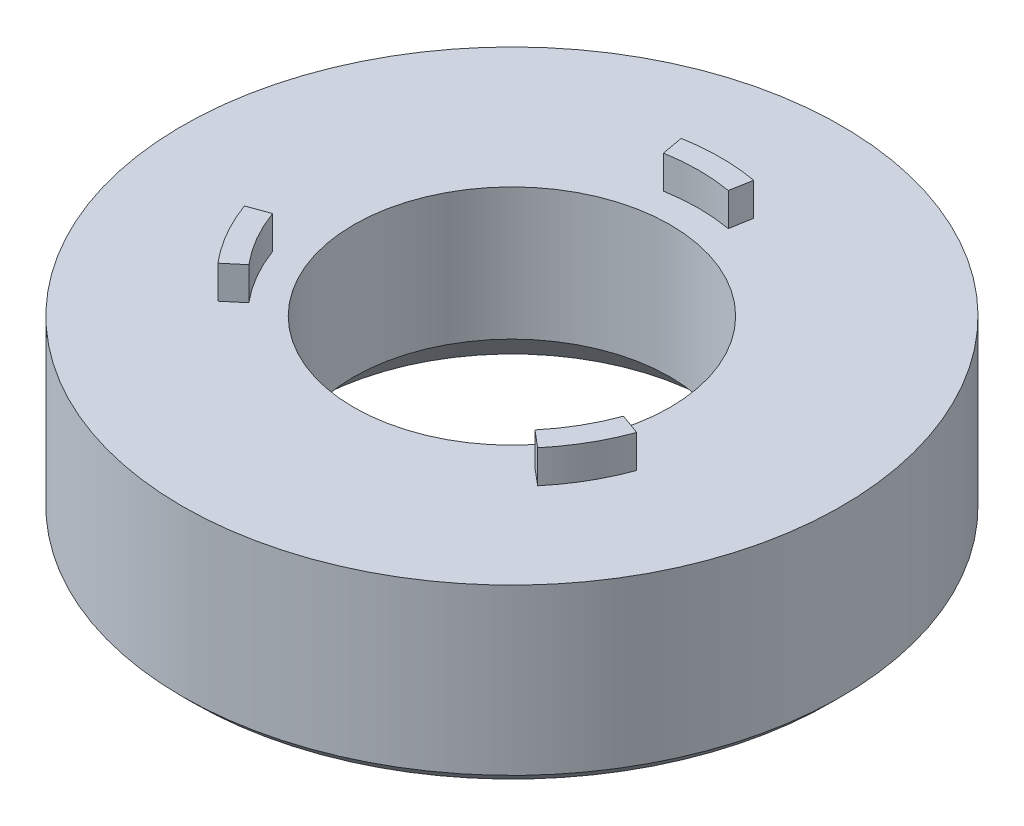
ISO-10303-21;
HEADER;
FILE_DESCRIPTION(('STEP AP214'),'2;1');
FILE_NAME('part.step','',(''),(''),'','','');
FILE_SCHEMA(('AUTOMOTIVE_DESIGN { 1 0 10303 214 1 1 1 1 }'));
ENDSEC;
DATA;
#1=APPLICATION_CONTEXT('core data for automotive mechanical design processes');
#2=APPLICATION_PROTOCOL_DEFINITION('international standard','automotive_design',2000,#1);
#3=PRODUCT_CONTEXT('',#1,'mechanical');
#4=PRODUCT('Part','Part','',(#3));
#5=PRODUCT_RELATED_PRODUCT_CATEGORY('part','',(#4));
#6=PRODUCT_DEFINITION_FORMATION('','',#4);
#7=PRODUCT_DEFINITION_CONTEXT('part definition',#1,'design');
#8=PRODUCT_DEFINITION('design','',#6,#7);
#9=PRODUCT_DEFINITION_SHAPE('','',#8);
#10=(LENGTH_UNIT() NAMED_UNIT(*) SI_UNIT(.MILLI.,.METRE.));
#11=(NAMED_UNIT(*) PLANE_ANGLE_UNIT() SI_UNIT($,.RADIAN.));
#12=(NAMED_UNIT(*) SI_UNIT($,.STERADIAN.) SOLID_ANGLE_UNIT());
#13=UNCERTAINTY_MEASURE_WITH_UNIT(LENGTH_MEASURE(1.E-05),#10,'distance_accuracy_value','');
#14=(GEOMETRIC_REPRESENTATION_CONTEXT(3) GLOBAL_UNCERTAINTY_ASSIGNED_CONTEXT((#13)) GLOBAL_UNIT_ASSIGNED_CONTEXT((#10,
#11,#12)) REPRESENTATION_CONTEXT('',''));
#15=CARTESIAN_POINT('',(0.,0.,0.));
#16=DIRECTION('',(0.,0.,1.));
#17=DIRECTION('',(1.,0.,0.));
#18=AXIS2_PLACEMENT_3D('',#15,#16,#17);
#19=CARTESIAN_POINT('',(0.,8.,0.));
#20=DIRECTION('',(0.,1.,0.));
#21=DIRECTION('',(0.,0.,1.));
#22=AXIS2_PLACEMENT_3D('',#19,#20,#21);
#23=PLANE('',#22);
#24=CARTESIAN_POINT('',(0.,8.,0.));
#25=DIRECTION('',(0.,1.,0.));
#26=DIRECTION('',(0.,0.,1.));
#27=AXIS2_PLACEMENT_3D('',#24,#25,#26);
#28=CIRCLE('',#27,15.);
#29=CARTESIAN_POINT('',(0.,8.,15.));
#30=VERTEX_POINT('',#29);
#31=EDGE_CURVE('E256',#30,#30,#28,.T.);
#32=ORIENTED_EDGE('',*,*,#31,.T.);
#33=EDGE_LOOP('',(#32));
#34=FACE_BOUND('',#33,.T.);
#35=CARTESIAN_POINT('',(0.,8.,0.));
#36=DIRECTION('',(0.,1.,0.));
#37=DIRECTION('',(0.,0.,1.));
#38=AXIS2_PLACEMENT_3D('',#35,#36,#37);
#39=CIRCLE('',#38,7.2);
#40=CARTESIAN_POINT('',(0.,8.,7.2));
#41=VERTEX_POINT('',#40);
#42=EDGE_CURVE('E252',#41,#41,#39,.T.);
#43=ORIENTED_EDGE('',*,*,#42,.F.);
#44=EDGE_LOOP('',(#43));
#45=FACE_BOUND('',#44,.T.);
#46=DIRECTION('',(0.173648177666923,0.,0.984807753012209));
#47=VECTOR('',#46,1.);
#48=CARTESIAN_POINT('',(-1.64965768783577,8.,-9.35567365361599));
#49=LINE('',#48,#47);
#50=CARTESIAN_POINT('',(-1.64965768783577,8.,-9.35567365361599));
#51=VERTEX_POINT('',#50);
#52=CARTESIAN_POINT('',(-1.47600951016885,8.,-8.37086590060378));
#53=VERTEX_POINT('',#52);
#54=EDGE_CURVE('E230',#51,#53,#49,.T.);
#55=ORIENTED_EDGE('',*,*,#54,.F.);
#56=CARTESIAN_POINT('',(0.,8.,0.));
#57=DIRECTION('',(0.,1.,0.));
#58=DIRECTION('',(0.,0.,1.));
#59=AXIS2_PLACEMENT_3D('',#56,#57,#58);
#60=CIRCLE('',#59,9.5);
#61=CARTESIAN_POINT('',(1.64965768783577,8.,-9.35567365361599));
#62=VERTEX_POINT('',#61);
#63=EDGE_CURVE('E211',#62,#51,#60,.T.);
#64=ORIENTED_EDGE('',*,*,#63,.F.);
#65=DIRECTION('',(0.173648177666923,0.,-0.984807753012209));
#66=VECTOR('',#65,1.);
#67=CARTESIAN_POINT('',(1.64965768783577,8.,-9.35567365361599));
#68=LINE('',#67,#66);
#69=CARTESIAN_POINT('',(1.47600951016885,8.,-8.37086590060378));
#70=VERTEX_POINT('',#69);
#71=EDGE_CURVE('E217',#70,#62,#68,.T.);
#72=ORIENTED_EDGE('',*,*,#71,.F.);
#73=CARTESIAN_POINT('',(0.,8.,0.));
#74=DIRECTION('',(0.,-1.,0.));
#75=DIRECTION('',(0.,0.,1.));
#76=AXIS2_PLACEMENT_3D('',#73,#74,#75);
#77=CIRCLE('',#76,8.5);
#78=EDGE_CURVE('E233',#53,#70,#77,.T.);
#79=ORIENTED_EDGE('',*,*,#78,.F.);
#80=EDGE_LOOP('',(#55,#64,#72,#79));
#81=FACE_BOUND('',#80,.T.);
#82=DIRECTION('',(0.76604444311898,0.,-0.642787609686538));
#83=VECTOR('',#82,1.);
#84=CARTESIAN_POINT('',(-7.27742220963031,8.,6.10648229202211));
#85=LINE('',#84,#83);
#86=CARTESIAN_POINT('',(-7.27742220963031,8.,6.10648229202211));
#87=VERTEX_POINT('',#86);
#88=CARTESIAN_POINT('',(-6.51137776651133,8.,5.46369468233557));
#89=VERTEX_POINT('',#88);
#90=EDGE_CURVE('E172',#87,#89,#85,.T.);
#91=ORIENTED_EDGE('',*,*,#90,.F.);
#92=CARTESIAN_POINT('',(0.,8.,0.));
#93=DIRECTION('',(0.,1.,0.));
#94=DIRECTION('',(0.866025403784436,0.,-0.500000000000004));
#95=AXIS2_PLACEMENT_3D('',#92,#93,#94);
#96=CIRCLE('',#95,9.5);
#97=CARTESIAN_POINT('',(-8.92707989746609,8.,3.24919136159396));
#98=VERTEX_POINT('',#97);
#99=EDGE_CURVE('E167',#98,#87,#96,.T.);
#100=ORIENTED_EDGE('',*,*,#99,.F.);
#101=DIRECTION('',(-0.939692620785904,0.,0.34202014332568));
#102=VECTOR('',#101,1.);
#103=CARTESIAN_POINT('',(-8.92707989746609,8.,3.24919136159396));
#104=LINE('',#103,#102);
#105=CARTESIAN_POINT('',(-7.98738727668019,8.,2.90717121826828));
#106=VERTEX_POINT('',#105);
#107=EDGE_CURVE('E182',#106,#98,#104,.T.);
#108=ORIENTED_EDGE('',*,*,#107,.F.);
#109=CARTESIAN_POINT('',(0.,8.,0.));
#110=DIRECTION('',(0.,-1.,0.));
#111=DIRECTION('',(0.866025403784436,0.,-0.500000000000004));
#112=AXIS2_PLACEMENT_3D('',#109,#110,#111);
#113=CIRCLE('',#112,8.5);
#114=EDGE_CURVE('E194',#89,#106,#113,.T.);
#115=ORIENTED_EDGE('',*,*,#114,.F.);
#116=EDGE_LOOP('',(#91,#100,#108,#115));
#117=FACE_BOUND('',#116,.T.);
#118=DIRECTION('',(-0.939692620785909,0.,-0.342020143325667));
#119=VECTOR('',#118,1.);
#120=CARTESIAN_POINT('',(8.92707989746614,8.,3.24919136159383));
#121=LINE('',#120,#119);
#122=CARTESIAN_POINT('',(8.92707989746614,8.,3.24919136159383));
#123=VERTEX_POINT('',#122);
#124=CARTESIAN_POINT('',(7.98738727668023,8.,2.90717121826817));
#125=VERTEX_POINT('',#124);
#126=EDGE_CURVE('E328',#123,#125,#121,.T.);
#127=ORIENTED_EDGE('',*,*,#126,.F.);
#128=CARTESIAN_POINT('',(0.,8.,0.));
#129=DIRECTION('',(0.,1.,0.));
#130=DIRECTION('',(-0.866025403784443,0.,-0.499999999999992));
#131=AXIS2_PLACEMENT_3D('',#128,#129,#130);
#132=CIRCLE('',#131,9.5);
#133=CARTESIAN_POINT('',(7.27742220963039,8.,6.106482292022));
#134=VERTEX_POINT('',#133);
#135=EDGE_CURVE('E164',#134,#123,#132,.T.);
#136=ORIENTED_EDGE('',*,*,#135,.F.);
#137=DIRECTION('',(0.766044443118989,0.,0.642787609686527));
#138=VECTOR('',#137,1.);
#139=CARTESIAN_POINT('',(7.27742220963039,8.,6.106482292022));
#140=LINE('',#139,#138);
#141=CARTESIAN_POINT('',(6.5113777665114,8.,5.46369468233548));
#142=VERTEX_POINT('',#141);
#143=EDGE_CURVE('E160',#142,#134,#140,.T.);
#144=ORIENTED_EDGE('',*,*,#143,.F.);
#145=CARTESIAN_POINT('',(0.,8.,0.));
#146=DIRECTION('',(0.,-1.,0.));
#147=DIRECTION('',(-0.866025403784443,0.,-0.499999999999992));
#148=AXIS2_PLACEMENT_3D('',#145,#146,#147);
#149=CIRCLE('',#148,8.5);
#150=EDGE_CURVE('E330',#125,#142,#149,.T.);
#151=ORIENTED_EDGE('',*,*,#150,.F.);
#152=EDGE_LOOP('',(#127,#136,#144,#151));
#153=FACE_BOUND('',#152,.T.);
#154=ADVANCED_FACE('F47',(#34,#45,#81,#117,#153),#23,.T.);
#155=CARTESIAN_POINT('',(0.,0.,0.));
#156=DIRECTION('',(0.,1.,0.));
#157=DIRECTION('',(0.,0.,1.));
#158=AXIS2_PLACEMENT_3D('',#155,#156,#157);
#159=PLANE('',#158);
#160=CARTESIAN_POINT('',(0.,0.,0.));
#161=DIRECTION('',(0.,1.,0.));
#162=DIRECTION('',(0.,0.,1.));
#163=AXIS2_PLACEMENT_3D('',#160,#161,#162);
#164=CIRCLE('',#163,9.20000000000001);
#165=CARTESIAN_POINT('',(0.,0.,9.20000000000001));
#166=VERTEX_POINT('',#165);
#167=EDGE_CURVE('E57',#166,#166,#164,.T.);
#168=ORIENTED_EDGE('',*,*,#167,.T.);
#169=EDGE_LOOP('',(#168));
#170=FACE_BOUND('',#169,.T.);
#171=CARTESIAN_POINT('',(0.,0.,0.));
#172=DIRECTION('',(0.,1.,0.));
#173=DIRECTION('',(0.,0.,1.));
#174=AXIS2_PLACEMENT_3D('',#171,#172,#173);
#175=CIRCLE('',#174,14.5);
#176=CARTESIAN_POINT('',(0.,0.,14.5));
#177=VERTEX_POINT('',#176);
#178=EDGE_CURVE('E264',#177,#177,#175,.F.);
#179=ORIENTED_EDGE('',*,*,#178,.T.);
#180=EDGE_LOOP('',(#179));
#181=FACE_BOUND('',#180,.T.);
#182=ADVANCED_FACE('F271',(#170,#181),#159,.F.);
#183=CARTESIAN_POINT('',(0.,8.,0.));
#184=DIRECTION('',(0.,-1.,0.));
#185=DIRECTION('',(0.,0.,-1.));
#186=AXIS2_PLACEMENT_3D('',#183,#184,#185);
#187=CYLINDRICAL_SURFACE('',#186,15.);
#188=CARTESIAN_POINT('',(0.,0.500000000000009,0.));
#189=DIRECTION('',(0.,1.,0.));
#190=DIRECTION('',(0.,0.,1.));
#191=AXIS2_PLACEMENT_3D('',#188,#189,#190);
#192=CIRCLE('',#191,15.);
#193=CARTESIAN_POINT('',(0.,0.500000000000009,15.));
#194=VERTEX_POINT('',#193);
#195=EDGE_CURVE('E260',#194,#194,#192,.T.);
#196=ORIENTED_EDGE('',*,*,#195,.T.);
#197=EDGE_LOOP('',(#196));
#198=FACE_BOUND('',#197,.T.);
#199=ORIENTED_EDGE('',*,*,#31,.F.);
#200=EDGE_LOOP('',(#199));
#201=FACE_BOUND('',#200,.T.);
#202=ADVANCED_FACE('F294',(#198,#201),#187,.T.);
#203=CARTESIAN_POINT('',(0.,8.,0.));
#204=DIRECTION('',(0.,-1.,0.));
#205=DIRECTION('',(0.,0.,-1.));
#206=AXIS2_PLACEMENT_3D('',#203,#204,#205);
#207=CYLINDRICAL_SURFACE('',#206,7.2);
#208=CARTESIAN_POINT('',(0.,2.00000000000001,0.));
#209=DIRECTION('',(0.,1.,0.));
#210=DIRECTION('',(0.,0.,1.));
#211=AXIS2_PLACEMENT_3D('',#208,#209,#210);
#212=CIRCLE('',#211,7.2);
#213=CARTESIAN_POINT('',(0.,2.00000000000001,7.2));
#214=VERTEX_POINT('',#213);
#215=EDGE_CURVE('E11',#214,#214,#212,.F.);
#216=ORIENTED_EDGE('',*,*,#215,.T.);
#217=EDGE_LOOP('',(#216));
#218=FACE_BOUND('',#217,.T.);
#219=ORIENTED_EDGE('',*,*,#42,.T.);
#220=EDGE_LOOP('',(#219));
#221=FACE_BOUND('',#220,.T.);
#222=ADVANCED_FACE('F285',(#218,#221),#207,.F.);
#223=CARTESIAN_POINT('',(0.,0.500000000000009,0.));
#224=DIRECTION('',(0.,1.,0.));
#225=DIRECTION('',(0.,0.,1.));
#226=AXIS2_PLACEMENT_3D('',#223,#224,#225);
#227=CONICAL_SURFACE('',#226,15.,0.785398163397452);
#228=ORIENTED_EDGE('',*,*,#178,.F.);
#229=EDGE_LOOP('',(#228));
#230=FACE_BOUND('',#229,.T.);
#231=ORIENTED_EDGE('',*,*,#195,.F.);
#232=EDGE_LOOP('',(#231));
#233=FACE_BOUND('',#232,.T.);
#234=ADVANCED_FACE('F276',(#230,#233),#227,.T.);
#235=CARTESIAN_POINT('',(0.,0.,0.));
#236=DIRECTION('',(0.,-1.,0.));
#237=DIRECTION('',(0.,0.,-1.));
#238=AXIS2_PLACEMENT_3D('',#235,#236,#237);
#239=CONICAL_SURFACE('',#238,9.20000000000001,0.785398163397448);
#240=ORIENTED_EDGE('',*,*,#215,.F.);
#241=EDGE_LOOP('',(#240));
#242=FACE_BOUND('',#241,.T.);
#243=ORIENTED_EDGE('',*,*,#167,.F.);
#244=EDGE_LOOP('',(#243));
#245=FACE_BOUND('',#244,.T.);
#246=ADVANCED_FACE('F50',(#242,#245),#239,.F.);
#247=CARTESIAN_POINT('',(0.,9.5,0.));
#248=DIRECTION('',(0.,-1.,0.));
#249=DIRECTION('',(0.,0.,-1.));
#250=AXIS2_PLACEMENT_3D('',#247,#248,#249);
#251=CYLINDRICAL_SURFACE('',#250,9.5);
#252=ORIENTED_EDGE('',*,*,#63,.T.);
#253=DIRECTION('',(0.,-1.,0.));
#254=VECTOR('',#253,1.);
#255=CARTESIAN_POINT('',(-1.64965768783577,9.5,-9.35567365361599));
#256=LINE('',#255,#254);
#257=CARTESIAN_POINT('',(-1.64965768783577,9.5,-9.35567365361599));
#258=VERTEX_POINT('',#257);
#259=EDGE_CURVE('E249',#258,#51,#256,.T.);
#260=ORIENTED_EDGE('',*,*,#259,.F.);
#261=CARTESIAN_POINT('',(0.,9.5,0.));
#262=DIRECTION('',(0.,1.,0.));
#263=DIRECTION('',(0.,0.,1.));
#264=AXIS2_PLACEMENT_3D('',#261,#262,#263);
#265=CIRCLE('',#264,9.5);
#266=CARTESIAN_POINT('',(1.64965768783577,9.5,-9.35567365361599));
#267=VERTEX_POINT('',#266);
#268=EDGE_CURVE('E212',#267,#258,#265,.T.);
#269=ORIENTED_EDGE('',*,*,#268,.F.);
#270=DIRECTION('',(0.,-1.,0.));
#271=VECTOR('',#270,1.);
#272=CARTESIAN_POINT('',(1.64965768783577,9.5,-9.35567365361599));
#273=LINE('',#272,#271);
#274=EDGE_CURVE('E226',#267,#62,#273,.T.);
#275=ORIENTED_EDGE('',*,*,#274,.T.);
#276=EDGE_LOOP('',(#252,#260,#269,#275));
#277=FACE_BOUND('',#276,.T.);
#278=ADVANCED_FACE('F275',(#277),#251,.T.);
#279=CARTESIAN_POINT('',(-1.64965768783577,9.5,-9.35567365361599));
#280=DIRECTION('',(0.984807753012209,0.,-0.173648177666923));
#281=DIRECTION('',(-0.173648177666923,0.,-0.984807753012209));
#282=AXIS2_PLACEMENT_3D('',#279,#280,#281);
#283=PLANE('',#282);
#284=ORIENTED_EDGE('',*,*,#54,.T.);
#285=DIRECTION('',(0.,-1.,0.));
#286=VECTOR('',#285,1.);
#287=CARTESIAN_POINT('',(-1.47600951016885,9.5,-8.37086590060378));
#288=LINE('',#287,#286);
#289=CARTESIAN_POINT('',(-1.47600951016885,9.5,-8.37086590060378));
#290=VERTEX_POINT('',#289);
#291=EDGE_CURVE('E245',#290,#53,#288,.T.);
#292=ORIENTED_EDGE('',*,*,#291,.F.);
#293=DIRECTION('',(0.173648177666923,0.,0.984807753012209));
#294=VECTOR('',#293,1.);
#295=CARTESIAN_POINT('',(-1.64965768783577,9.5,-9.35567365361599));
#296=LINE('',#295,#294);
#297=EDGE_CURVE('E216',#258,#290,#296,.T.);
#298=ORIENTED_EDGE('',*,*,#297,.F.);
#299=ORIENTED_EDGE('',*,*,#259,.T.);
#300=EDGE_LOOP('',(#284,#292,#298,#299));
#301=FACE_BOUND('',#300,.T.);
#302=ADVANCED_FACE('F282',(#301),#283,.F.);
#303=CARTESIAN_POINT('',(0.,9.5,0.));
#304=DIRECTION('',(0.,-1.,0.));
#305=DIRECTION('',(0.,0.,-1.));
#306=AXIS2_PLACEMENT_3D('',#303,#304,#305);
#307=CYLINDRICAL_SURFACE('',#306,8.5);
#308=ORIENTED_EDGE('',*,*,#78,.T.);
#309=DIRECTION('',(0.,-1.,0.));
#310=VECTOR('',#309,1.);
#311=CARTESIAN_POINT('',(1.47600951016885,9.5,-8.37086590060378));
#312=LINE('',#311,#310);
#313=CARTESIAN_POINT('',(1.47600951016885,9.5,-8.37086590060378));
#314=VERTEX_POINT('',#313);
#315=EDGE_CURVE('E242',#314,#70,#312,.T.);
#316=ORIENTED_EDGE('',*,*,#315,.F.);
#317=CARTESIAN_POINT('',(0.,9.5,0.));
#318=DIRECTION('',(0.,-1.,0.));
#319=DIRECTION('',(0.,0.,1.));
#320=AXIS2_PLACEMENT_3D('',#317,#318,#319);
#321=CIRCLE('',#320,8.5);
#322=EDGE_CURVE('E220',#290,#314,#321,.T.);
#323=ORIENTED_EDGE('',*,*,#322,.F.);
#324=ORIENTED_EDGE('',*,*,#291,.T.);
#325=EDGE_LOOP('',(#308,#316,#323,#324));
#326=FACE_BOUND('',#325,.T.);
#327=ADVANCED_FACE('F389',(#326),#307,.F.);
#328=CARTESIAN_POINT('',(1.64965768783577,9.5,-9.35567365361599));
#329=DIRECTION('',(-0.984807753012209,0.,-0.173648177666923));
#330=DIRECTION('',(-0.173648177666923,0.,0.984807753012209));
#331=AXIS2_PLACEMENT_3D('',#328,#329,#330);
#332=PLANE('',#331);
#333=ORIENTED_EDGE('',*,*,#71,.T.);
#334=ORIENTED_EDGE('',*,*,#274,.F.);
#335=DIRECTION('',(0.173648177666923,0.,-0.984807753012209));
#336=VECTOR('',#335,1.);
#337=CARTESIAN_POINT('',(1.64965768783577,9.5,-9.35567365361599));
#338=LINE('',#337,#336);
#339=EDGE_CURVE('E223',#314,#267,#338,.T.);
#340=ORIENTED_EDGE('',*,*,#339,.F.);
#341=ORIENTED_EDGE('',*,*,#315,.T.);
#342=EDGE_LOOP('',(#333,#334,#340,#341));
#343=FACE_BOUND('',#342,.T.);
#344=ADVANCED_FACE('F385',(#343),#332,.F.);
#345=CARTESIAN_POINT('',(0.,9.5,0.));
#346=DIRECTION('',(0.,1.,0.));
#347=DIRECTION('',(0.,0.,1.));
#348=AXIS2_PLACEMENT_3D('',#345,#346,#347);
#349=PLANE('',#348);
#350=ORIENTED_EDGE('',*,*,#268,.T.);
#351=ORIENTED_EDGE('',*,*,#297,.T.);
#352=ORIENTED_EDGE('',*,*,#322,.T.);
#353=ORIENTED_EDGE('',*,*,#339,.T.);
#354=EDGE_LOOP('',(#350,#351,#352,#353));
#355=FACE_BOUND('',#354,.T.);
#356=ADVANCED_FACE('F381',(#355),#349,.T.);
#357=CARTESIAN_POINT('',(0.,9.5,0.));
#358=DIRECTION('',(0.,-1.,0.));
#359=DIRECTION('',(0.,0.,-1.));
#360=AXIS2_PLACEMENT_3D('',#357,#358,#359);
#361=CYLINDRICAL_SURFACE('',#360,9.5);
#362=ORIENTED_EDGE('',*,*,#99,.T.);
#363=DIRECTION('',(0.,-1.,0.));
#364=VECTOR('',#363,1.);
#365=CARTESIAN_POINT('',(-7.27742220963031,9.5,6.10648229202211));
#366=LINE('',#365,#364);
#367=CARTESIAN_POINT('',(-7.27742220963031,9.5,6.10648229202211));
#368=VERTEX_POINT('',#367);
#369=EDGE_CURVE('E208',#368,#87,#366,.T.);
#370=ORIENTED_EDGE('',*,*,#369,.F.);
#371=CARTESIAN_POINT('',(0.,9.5,0.));
#372=DIRECTION('',(0.,1.,0.));
#373=DIRECTION('',(0.866025403784436,0.,-0.500000000000004));
#374=AXIS2_PLACEMENT_3D('',#371,#372,#373);
#375=CIRCLE('',#374,9.5);
#376=CARTESIAN_POINT('',(-8.92707989746609,9.5,3.24919136159396));
#377=VERTEX_POINT('',#376);
#378=EDGE_CURVE('E177',#377,#368,#375,.T.);
#379=ORIENTED_EDGE('',*,*,#378,.F.);
#380=DIRECTION('',(0.,-1.,0.));
#381=VECTOR('',#380,1.);
#382=CARTESIAN_POINT('',(-8.92707989746609,9.5,3.24919136159396));
#383=LINE('',#382,#381);
#384=EDGE_CURVE('E190',#377,#98,#383,.T.);
#385=ORIENTED_EDGE('',*,*,#384,.T.);
#386=EDGE_LOOP('',(#362,#370,#379,#385));
#387=FACE_BOUND('',#386,.T.);
#388=ADVANCED_FACE('F377',(#387),#361,.T.);
#389=CARTESIAN_POINT('',(-7.27742220963031,9.5,6.10648229202211));
#390=DIRECTION('',(-0.642787609686537,0.,-0.76604444311898));
#391=DIRECTION('',(-0.76604444311898,0.,0.642787609686537));
#392=AXIS2_PLACEMENT_3D('',#389,#390,#391);
#393=PLANE('',#392);
#394=ORIENTED_EDGE('',*,*,#90,.T.);
#395=DIRECTION('',(0.,-1.,0.));
#396=VECTOR('',#395,1.);
#397=CARTESIAN_POINT('',(-6.51137776651133,9.5,5.46369468233557));
#398=LINE('',#397,#396);
#399=CARTESIAN_POINT('',(-6.51137776651133,9.5,5.46369468233557));
#400=VERTEX_POINT('',#399);
#401=EDGE_CURVE('E204',#400,#89,#398,.T.);
#402=ORIENTED_EDGE('',*,*,#401,.F.);
#403=DIRECTION('',(0.76604444311898,0.,-0.642787609686538));
#404=VECTOR('',#403,1.);
#405=CARTESIAN_POINT('',(-7.27742220963031,9.5,6.10648229202211));
#406=LINE('',#405,#404);
#407=EDGE_CURVE('E181',#368,#400,#406,.T.);
#408=ORIENTED_EDGE('',*,*,#407,.F.);
#409=ORIENTED_EDGE('',*,*,#369,.T.);
#410=EDGE_LOOP('',(#394,#402,#408,#409));
#411=FACE_BOUND('',#410,.T.);
#412=ADVANCED_FACE('F373',(#411),#393,.F.);
#413=CARTESIAN_POINT('',(0.,9.5,0.));
#414=DIRECTION('',(0.,-1.,0.));
#415=DIRECTION('',(0.,0.,-1.));
#416=AXIS2_PLACEMENT_3D('',#413,#414,#415);
#417=CYLINDRICAL_SURFACE('',#416,8.5);
#418=ORIENTED_EDGE('',*,*,#114,.T.);
#419=DIRECTION('',(0.,-1.,0.));
#420=VECTOR('',#419,1.);
#421=CARTESIAN_POINT('',(-7.98738727668019,9.5,2.90717121826828));
#422=LINE('',#421,#420);
#423=CARTESIAN_POINT('',(-7.98738727668019,9.5,2.90717121826828));
#424=VERTEX_POINT('',#423);
#425=EDGE_CURVE('E72',#424,#106,#422,.T.);
#426=ORIENTED_EDGE('',*,*,#425,.F.);
#427=CARTESIAN_POINT('',(0.,9.5,0.));
#428=DIRECTION('',(0.,-1.,0.));
#429=DIRECTION('',(0.866025403784436,0.,-0.500000000000004));
#430=AXIS2_PLACEMENT_3D('',#427,#428,#429);
#431=CIRCLE('',#430,8.5);
#432=EDGE_CURVE('E185',#400,#424,#431,.T.);
#433=ORIENTED_EDGE('',*,*,#432,.F.);
#434=ORIENTED_EDGE('',*,*,#401,.T.);
#435=EDGE_LOOP('',(#418,#426,#433,#434));
#436=FACE_BOUND('',#435,.T.);
#437=ADVANCED_FACE('F370',(#436),#417,.F.);
#438=CARTESIAN_POINT('',(-8.92707989746609,9.5,3.24919136159396));
#439=DIRECTION('',(0.34202014332568,0.,0.939692620785904));
#440=DIRECTION('',(0.939692620785905,0.,-0.34202014332568));
#441=AXIS2_PLACEMENT_3D('',#438,#439,#440);
#442=PLANE('',#441);
#443=ORIENTED_EDGE('',*,*,#107,.T.);
#444=ORIENTED_EDGE('',*,*,#384,.F.);
#445=DIRECTION('',(-0.939692620785904,0.,0.34202014332568));
#446=VECTOR('',#445,1.);
#447=CARTESIAN_POINT('',(-8.92707989746609,9.5,3.24919136159396));
#448=LINE('',#447,#446);
#449=EDGE_CURVE('E188',#424,#377,#448,.T.);
#450=ORIENTED_EDGE('',*,*,#449,.F.);
#451=ORIENTED_EDGE('',*,*,#425,.T.);
#452=EDGE_LOOP('',(#443,#444,#450,#451));
#453=FACE_BOUND('',#452,.T.);
#454=ADVANCED_FACE('F366',(#453),#442,.F.);
#455=CARTESIAN_POINT('',(0.,9.5,0.));
#456=DIRECTION('',(0.,1.,0.));
#457=DIRECTION('',(0.866025403784436,0.,-0.500000000000004));
#458=AXIS2_PLACEMENT_3D('',#455,#456,#457);
#459=PLANE('',#458);
#460=ORIENTED_EDGE('',*,*,#378,.T.);
#461=ORIENTED_EDGE('',*,*,#407,.T.);
#462=ORIENTED_EDGE('',*,*,#432,.T.);
#463=ORIENTED_EDGE('',*,*,#449,.T.);
#464=EDGE_LOOP('',(#460,#461,#462,#463));
#465=FACE_BOUND('',#464,.T.);
#466=ADVANCED_FACE('F363',(#465),#459,.T.);
#467=CARTESIAN_POINT('',(0.,9.5,0.));
#468=DIRECTION('',(0.,-1.,0.));
#469=DIRECTION('',(0.,0.,-1.));
#470=AXIS2_PLACEMENT_3D('',#467,#468,#469);
#471=CYLINDRICAL_SURFACE('',#470,9.5);
#472=ORIENTED_EDGE('',*,*,#135,.T.);
#473=DIRECTION('',(0.,-1.,0.));
#474=VECTOR('',#473,1.);
#475=CARTESIAN_POINT('',(8.92707989746614,9.5,3.24919136159383));
#476=LINE('',#475,#474);
#477=CARTESIAN_POINT('',(8.92707989746614,9.5,3.24919136159383));
#478=VERTEX_POINT('',#477);
#479=EDGE_CURVE('E143',#478,#123,#476,.T.);
#480=ORIENTED_EDGE('',*,*,#479,.F.);
#481=CARTESIAN_POINT('',(0.,9.5,0.));
#482=DIRECTION('',(0.,1.,0.));
#483=DIRECTION('',(-0.866025403784443,0.,-0.499999999999992));
#484=AXIS2_PLACEMENT_3D('',#481,#482,#483);
#485=CIRCLE('',#484,9.5);
#486=CARTESIAN_POINT('',(7.27742220963039,9.5,6.106482292022));
#487=VERTEX_POINT('',#486);
#488=EDGE_CURVE('E151',#487,#478,#485,.T.);
#489=ORIENTED_EDGE('',*,*,#488,.F.);
#490=DIRECTION('',(0.,-1.,0.));
#491=VECTOR('',#490,1.);
#492=CARTESIAN_POINT('',(7.27742220963039,9.5,6.106482292022));
#493=LINE('',#492,#491);
#494=EDGE_CURVE('E341',#487,#134,#493,.T.);
#495=ORIENTED_EDGE('',*,*,#494,.T.);
#496=EDGE_LOOP('',(#472,#480,#489,#495));
#497=FACE_BOUND('',#496,.T.);
#498=ADVANCED_FACE('F162',(#497),#471,.T.);
#499=CARTESIAN_POINT('',(8.92707989746614,9.5,3.24919136159383));
#500=DIRECTION('',(-0.342020143325666,0.,0.939692620785909));
#501=DIRECTION('',(0.939692620785909,0.,0.342020143325667));
#502=AXIS2_PLACEMENT_3D('',#499,#500,#501);
#503=PLANE('',#502);
#504=ORIENTED_EDGE('',*,*,#126,.T.);
#505=DIRECTION('',(0.,-1.,0.));
#506=VECTOR('',#505,1.);
#507=CARTESIAN_POINT('',(7.98738727668023,9.5,2.90717121826817));
#508=LINE('',#507,#506);
#509=CARTESIAN_POINT('',(7.98738727668023,9.5,2.90717121826817));
#510=VERTEX_POINT('',#509);
#511=EDGE_CURVE('E146',#510,#125,#508,.T.);
#512=ORIENTED_EDGE('',*,*,#511,.F.);
#513=DIRECTION('',(-0.939692620785909,0.,-0.342020143325667));
#514=VECTOR('',#513,1.);
#515=CARTESIAN_POINT('',(8.92707989746614,9.5,3.24919136159383));
#516=LINE('',#515,#514);
#517=EDGE_CURVE('E139',#478,#510,#516,.T.);
#518=ORIENTED_EDGE('',*,*,#517,.F.);
#519=ORIENTED_EDGE('',*,*,#479,.T.);
#520=EDGE_LOOP('',(#504,#512,#518,#519));
#521=FACE_BOUND('',#520,.T.);
#522=ADVANCED_FACE('F141',(#521),#503,.F.);
#523=CARTESIAN_POINT('',(0.,9.5,0.));
#524=DIRECTION('',(0.,-1.,0.));
#525=DIRECTION('',(0.,0.,-1.));
#526=AXIS2_PLACEMENT_3D('',#523,#524,#525);
#527=CYLINDRICAL_SURFACE('',#526,8.5);
#528=ORIENTED_EDGE('',*,*,#150,.T.);
#529=DIRECTION('',(0.,-1.,0.));
#530=VECTOR('',#529,1.);
#531=CARTESIAN_POINT('',(6.5113777665114,9.5,5.46369468233548));
#532=LINE('',#531,#530);
#533=CARTESIAN_POINT('',(6.5113777665114,9.5,5.46369468233548));
#534=VERTEX_POINT('',#533);
#535=EDGE_CURVE('E64',#534,#142,#532,.T.);
#536=ORIENTED_EDGE('',*,*,#535,.F.);
#537=CARTESIAN_POINT('',(0.,9.5,0.));
#538=DIRECTION('',(0.,-1.,0.));
#539=DIRECTION('',(-0.866025403784443,0.,-0.499999999999992));
#540=AXIS2_PLACEMENT_3D('',#537,#538,#539);
#541=CIRCLE('',#540,8.5);
#542=EDGE_CURVE('E150',#510,#534,#541,.T.);
#543=ORIENTED_EDGE('',*,*,#542,.F.);
#544=ORIENTED_EDGE('',*,*,#511,.T.);
#545=EDGE_LOOP('',(#528,#536,#543,#544));
#546=FACE_BOUND('',#545,.T.);
#547=ADVANCED_FACE('F348',(#546),#527,.F.);
#548=CARTESIAN_POINT('',(7.27742220963039,9.5,6.106482292022));
#549=DIRECTION('',(0.642787609686527,0.,-0.766044443118989));
#550=DIRECTION('',(-0.766044443118989,0.,-0.642787609686527));
#551=AXIS2_PLACEMENT_3D('',#548,#549,#550);
#552=PLANE('',#551);
#553=ORIENTED_EDGE('',*,*,#143,.T.);
#554=ORIENTED_EDGE('',*,*,#494,.F.);
#555=DIRECTION('',(0.766044443118989,0.,0.642787609686527));
#556=VECTOR('',#555,1.);
#557=CARTESIAN_POINT('',(7.27742220963039,9.5,6.106482292022));
#558=LINE('',#557,#556);
#559=EDGE_CURVE('E155',#534,#487,#558,.T.);
#560=ORIENTED_EDGE('',*,*,#559,.F.);
#561=ORIENTED_EDGE('',*,*,#535,.T.);
#562=EDGE_LOOP('',(#553,#554,#560,#561));
#563=FACE_BOUND('',#562,.T.);
#564=ADVANCED_FACE('F349',(#563),#552,.F.);
#565=CARTESIAN_POINT('',(0.,9.5,0.));
#566=DIRECTION('',(0.,1.,0.));
#567=DIRECTION('',(-0.866025403784443,0.,-0.499999999999992));
#568=AXIS2_PLACEMENT_3D('',#565,#566,#567);
#569=PLANE('',#568);
#570=ORIENTED_EDGE('',*,*,#488,.T.);
#571=ORIENTED_EDGE('',*,*,#517,.T.);
#572=ORIENTED_EDGE('',*,*,#542,.T.);
#573=ORIENTED_EDGE('',*,*,#559,.T.);
#574=EDGE_LOOP('',(#570,#571,#572,#573));
#575=FACE_BOUND('',#574,.T.);
#576=ADVANCED_FACE('F154',(#575),#569,.T.);
#577=CLOSED_SHELL('',(#154,#182,#202,#222,#234,#246,#278,#302,#327,#344,#356,#388,#412,#437,
#454,#466,#498,#522,#547,#564,#576));
#578=MANIFOLD_SOLID_BREP('B2',#577);
#579=ADVANCED_BREP_SHAPE_REPRESENTATION('',(#18,#578),#14);
#580=SHAPE_DEFINITION_REPRESENTATION(#9,#579);
ENDSEC;
END-ISO-10303-21;
